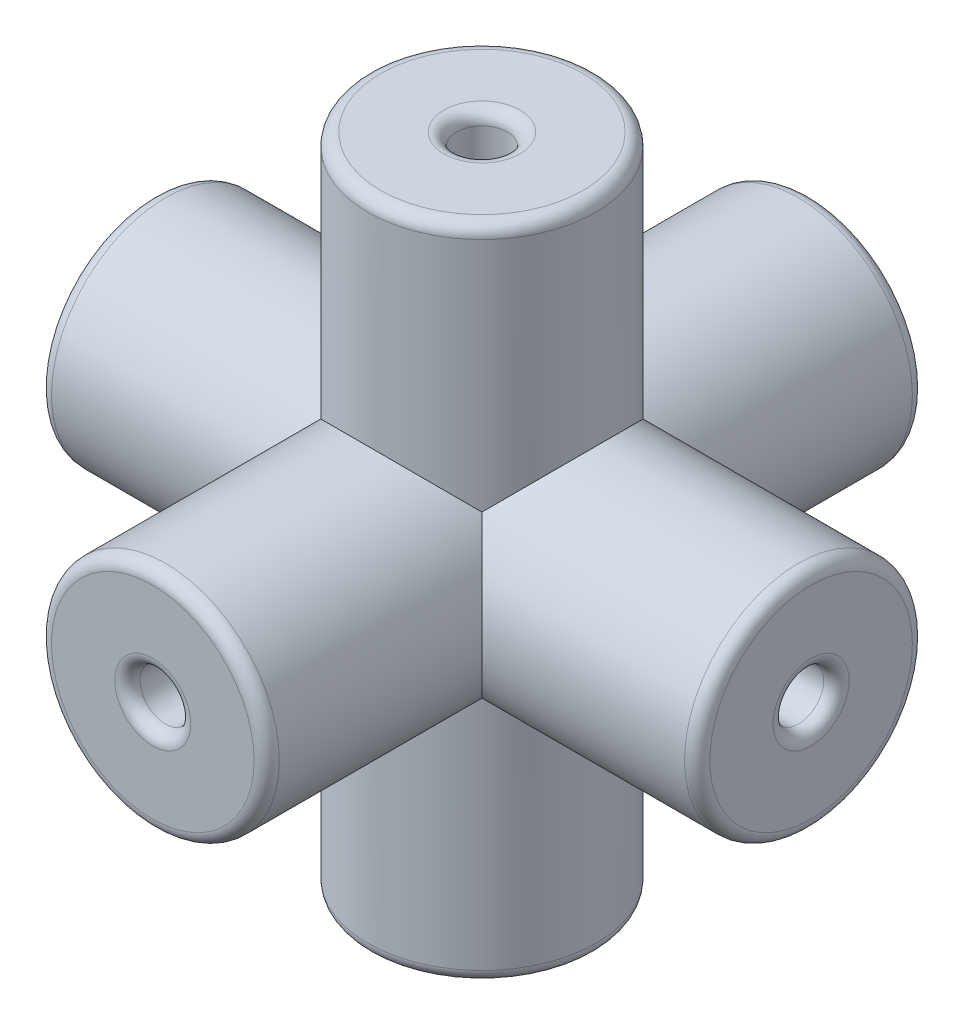
ISO-10303-21;
HEADER;
FILE_DESCRIPTION(('STEP AP214'),'2;1');
FILE_NAME('part.step','',(''),(''),'','','');
FILE_SCHEMA(('AUTOMOTIVE_DESIGN { 1 0 10303 214 1 1 1 1 }'));
ENDSEC;
DATA;
#1=APPLICATION_CONTEXT('core data for automotive mechanical design processes');
#2=APPLICATION_PROTOCOL_DEFINITION('international standard','automotive_design',2000,#1);
#3=PRODUCT_CONTEXT('',#1,'mechanical');
#4=PRODUCT('Part','Part','',(#3));
#5=PRODUCT_RELATED_PRODUCT_CATEGORY('part','',(#4));
#6=PRODUCT_DEFINITION_FORMATION('','',#4);
#7=PRODUCT_DEFINITION_CONTEXT('part definition',#1,'design');
#8=PRODUCT_DEFINITION('design','',#6,#7);
#9=PRODUCT_DEFINITION_SHAPE('','',#8);
#10=(LENGTH_UNIT() NAMED_UNIT(*) SI_UNIT(.MILLI.,.METRE.));
#11=(NAMED_UNIT(*) PLANE_ANGLE_UNIT() SI_UNIT($,.RADIAN.));
#12=(NAMED_UNIT(*) SI_UNIT($,.STERADIAN.) SOLID_ANGLE_UNIT());
#13=UNCERTAINTY_MEASURE_WITH_UNIT(LENGTH_MEASURE(1.E-05),#10,'distance_accuracy_value','');
#14=(GEOMETRIC_REPRESENTATION_CONTEXT(3) GLOBAL_UNCERTAINTY_ASSIGNED_CONTEXT((#13)) GLOBAL_UNIT_ASSIGNED_CONTEXT((#10,
#11,#12)) REPRESENTATION_CONTEXT('',''));
#15=CARTESIAN_POINT('',(0.,0.,0.));
#16=DIRECTION('',(0.,0.,1.));
#17=DIRECTION('',(1.,0.,0.));
#18=AXIS2_PLACEMENT_3D('',#15,#16,#17);
#19=CARTESIAN_POINT('',(0.,13.,0.));
#20=DIRECTION('',(0.,1.,0.));
#21=DIRECTION('',(0.,0.,1.));
#22=AXIS2_PLACEMENT_3D('',#19,#20,#21);
#23=CYLINDRICAL_SURFACE('',#22,0.999999999999997);
#24=CARTESIAN_POINT('',(0.,12.5,0.));
#25=DIRECTION('',(0.,1.,0.));
#26=DIRECTION('',(0.,0.,1.));
#27=AXIS2_PLACEMENT_3D('',#24,#25,#26);
#28=CIRCLE('',#27,0.999999999999997);
#29=CARTESIAN_POINT('',(0.,12.5,0.999999999999997));
#30=VERTEX_POINT('',#29);
#31=EDGE_CURVE('E155',#30,#30,#28,.T.);
#32=ORIENTED_EDGE('',*,*,#31,.T.);
#33=EDGE_LOOP('',(#32));
#34=FACE_BOUND('',#33,.T.);
#35=CARTESIAN_POINT('',(0.,0.,0.));
#36=DIRECTION('',(0.707106781186547,0.707106781186547,0.));
#37=DIRECTION('',(-0.707106781186547,0.707106781186547,0.));
#38=AXIS2_PLACEMENT_3D('',#35,#36,#37);
#39=ELLIPSE('',#38,1.41421356237309,0.999999999999994);
#40=CARTESIAN_POINT('',(-0.707106781186542,0.707106781186542,0.707106781186542));
#41=VERTEX_POINT('',#40);
#42=CARTESIAN_POINT('',(-0.707106781186542,0.707106781186542,-0.707106781186542));
#43=VERTEX_POINT('',#42);
#44=EDGE_CURVE('E111',#41,#43,#39,.F.);
#45=ORIENTED_EDGE('',*,*,#44,.T.);
#46=CARTESIAN_POINT('',(0.,0.,0.));
#47=DIRECTION('',(0.,0.707106781186547,0.707106781186547));
#48=DIRECTION('',(0.,0.707106781186547,-0.707106781186547));
#49=AXIS2_PLACEMENT_3D('',#46,#47,#48);
#50=ELLIPSE('',#49,1.41421356237309,0.999999999999994);
#51=CARTESIAN_POINT('',(0.707106781186542,0.707106781186542,-0.707106781186542));
#52=VERTEX_POINT('',#51);
#53=EDGE_CURVE('E248',#43,#52,#50,.F.);
#54=ORIENTED_EDGE('',*,*,#53,.T.);
#55=CARTESIAN_POINT('',(0.,0.,0.));
#56=DIRECTION('',(-0.707106781186547,0.707106781186547,0.));
#57=DIRECTION('',(0.707106781186547,0.707106781186547,0.));
#58=AXIS2_PLACEMENT_3D('',#55,#56,#57);
#59=ELLIPSE('',#58,1.41421356237309,0.999999999999994);
#60=CARTESIAN_POINT('',(0.707106781186543,0.707106781186543,0.707106781186543));
#61=VERTEX_POINT('',#60);
#62=EDGE_CURVE('E105',#52,#61,#59,.F.);
#63=ORIENTED_EDGE('',*,*,#62,.T.);
#64=CARTESIAN_POINT('',(0.,0.,0.));
#65=DIRECTION('',(0.,0.707106781186547,-0.707106781186547));
#66=DIRECTION('',(0.,0.707106781186547,0.707106781186547));
#67=AXIS2_PLACEMENT_3D('',#64,#65,#66);
#68=ELLIPSE('',#67,1.41421356237309,0.999999999999994);
#69=EDGE_CURVE('E98',#61,#41,#68,.F.);
#70=ORIENTED_EDGE('',*,*,#69,.T.);
#71=EDGE_LOOP('',(#45,#54,#63,#70));
#72=FACE_BOUND('',#71,.T.);
#73=ADVANCED_FACE('F33',(#34,#72),#23,.F.);
#74=CARTESIAN_POINT('',(0.,0.,13.));
#75=DIRECTION('',(0.,0.,-1.));
#76=DIRECTION('',(-1.,0.,0.));
#77=AXIS2_PLACEMENT_3D('',#74,#75,#76);
#78=CYLINDRICAL_SURFACE('',#77,4.5);
#79=CARTESIAN_POINT('',(0.,0.,12.5));
#80=DIRECTION('',(0.,0.,1.));
#81=DIRECTION('',(1.,0.,0.));
#82=AXIS2_PLACEMENT_3D('',#79,#80,#81);
#83=CIRCLE('',#82,4.5);
#84=CARTESIAN_POINT('',(4.5,0.,12.5));
#85=VERTEX_POINT('',#84);
#86=EDGE_CURVE('E188',#85,#85,#83,.F.);
#87=ORIENTED_EDGE('',*,*,#86,.T.);
#88=EDGE_LOOP('',(#87));
#89=FACE_BOUND('',#88,.T.);
#90=CARTESIAN_POINT('',(0.,0.,0.));
#91=DIRECTION('',(-0.707106781186547,0.,-0.707106781186547));
#92=DIRECTION('',(0.707106781186547,0.,-0.707106781186547));
#93=AXIS2_PLACEMENT_3D('',#90,#91,#92);
#94=ELLIPSE('',#93,6.36396103067893,4.5);
#95=CARTESIAN_POINT('',(-3.18198051533946,-3.18198051533946,3.18198051533946));
#96=VERTEX_POINT('',#95);
#97=CARTESIAN_POINT('',(-3.18198051533946,3.18198051533946,3.18198051533946));
#98=VERTEX_POINT('',#97);
#99=EDGE_CURVE('E270',#96,#98,#94,.T.);
#100=ORIENTED_EDGE('',*,*,#99,.F.);
#101=CARTESIAN_POINT('',(0.,0.,0.));
#102=DIRECTION('',(0.,-0.707106781186547,-0.707106781186547));
#103=DIRECTION('',(0.,0.707106781186547,-0.707106781186547));
#104=AXIS2_PLACEMENT_3D('',#101,#102,#103);
#105=ELLIPSE('',#104,6.36396103067893,4.5);
#106=CARTESIAN_POINT('',(3.18198051533946,-3.18198051533946,3.18198051533946));
#107=VERTEX_POINT('',#106);
#108=EDGE_CURVE('E278',#107,#96,#105,.T.);
#109=ORIENTED_EDGE('',*,*,#108,.F.);
#110=CARTESIAN_POINT('',(0.,0.,0.));
#111=DIRECTION('',(0.707106781186547,0.,-0.707106781186547));
#112=DIRECTION('',(-0.707106781186547,0.,-0.707106781186547));
#113=AXIS2_PLACEMENT_3D('',#110,#111,#112);
#114=ELLIPSE('',#113,6.36396103067893,4.5);
#115=CARTESIAN_POINT('',(3.18198051533947,3.18198051533946,3.18198051533946));
#116=VERTEX_POINT('',#115);
#117=EDGE_CURVE('E261',#116,#107,#114,.T.);
#118=ORIENTED_EDGE('',*,*,#117,.F.);
#119=CARTESIAN_POINT('',(0.,0.,0.));
#120=DIRECTION('',(0.,0.707106781186547,-0.707106781186547));
#121=DIRECTION('',(0.,-0.707106781186547,-0.707106781186547));
#122=AXIS2_PLACEMENT_3D('',#119,#120,#121);
#123=ELLIPSE('',#122,6.36396103067893,4.5);
#124=EDGE_CURVE('E276',#98,#116,#123,.T.);
#125=ORIENTED_EDGE('',*,*,#124,.F.);
#126=EDGE_LOOP('',(#100,#109,#118,#125));
#127=FACE_BOUND('',#126,.T.);
#128=ADVANCED_FACE('F222',(#89,#127),#78,.T.);
#129=CARTESIAN_POINT('',(0.,13.,0.));
#130=DIRECTION('',(0.,-1.,0.));
#131=DIRECTION('',(0.,0.,-1.));
#132=AXIS2_PLACEMENT_3D('',#129,#130,#131);
#133=CYLINDRICAL_SURFACE('',#132,4.5);
#134=CARTESIAN_POINT('',(0.,-12.5,0.));
#135=DIRECTION('',(0.,1.,0.));
#136=DIRECTION('',(0.,0.,1.));
#137=AXIS2_PLACEMENT_3D('',#134,#135,#136);
#138=CIRCLE('',#137,4.5);
#139=CARTESIAN_POINT('',(0.,-12.5,4.5));
#140=VERTEX_POINT('',#139);
#141=EDGE_CURVE('E140',#140,#140,#138,.T.);
#142=ORIENTED_EDGE('',*,*,#141,.T.);
#143=EDGE_LOOP('',(#142));
#144=FACE_BOUND('',#143,.T.);
#145=CARTESIAN_POINT('',(0.,0.,0.));
#146=DIRECTION('',(-0.707106781186547,-0.707106781186547,0.));
#147=DIRECTION('',(0.707106781186547,-0.707106781186547,0.));
#148=AXIS2_PLACEMENT_3D('',#145,#146,#147);
#149=ELLIPSE('',#148,6.36396103067893,4.5);
#150=CARTESIAN_POINT('',(3.18198051533946,-3.18198051533946,-3.18198051533946));
#151=VERTEX_POINT('',#150);
#152=EDGE_CURVE('E258',#107,#151,#149,.F.);
#153=ORIENTED_EDGE('',*,*,#152,.F.);
#154=ORIENTED_EDGE('',*,*,#108,.T.);
#155=CARTESIAN_POINT('',(0.,0.,0.));
#156=DIRECTION('',(0.707106781186547,-0.707106781186547,0.));
#157=DIRECTION('',(-0.707106781186547,-0.707106781186547,0.));
#158=AXIS2_PLACEMENT_3D('',#155,#156,#157);
#159=ELLIPSE('',#158,6.36396103067893,4.5);
#160=CARTESIAN_POINT('',(-3.18198051533946,-3.18198051533946,-3.18198051533946));
#161=VERTEX_POINT('',#160);
#162=EDGE_CURVE('E267',#161,#96,#159,.F.);
#163=ORIENTED_EDGE('',*,*,#162,.F.);
#164=CARTESIAN_POINT('',(0.,0.,0.));
#165=DIRECTION('',(0.,0.707106781186547,-0.707106781186547));
#166=DIRECTION('',(0.,-0.707106781186547,-0.707106781186547));
#167=AXIS2_PLACEMENT_3D('',#164,#165,#166);
#168=ELLIPSE('',#167,6.36396103067893,4.5);
#169=EDGE_CURVE('E273',#161,#151,#168,.F.);
#170=ORIENTED_EDGE('',*,*,#169,.T.);
#171=EDGE_LOOP('',(#153,#154,#163,#170));
#172=FACE_BOUND('',#171,.T.);
#173=ADVANCED_FACE('F229',(#144,#172),#133,.T.);
#174=CARTESIAN_POINT('',(0.,0.,-12.5));
#175=DIRECTION('',(0.,0.,1.));
#176=DIRECTION('',(1.,0.,0.));
#177=AXIS2_PLACEMENT_3D('',#174,#175,#176);
#178=CIRCLE('',#177,4.5);
#179=CARTESIAN_POINT('',(4.5,0.,-12.5));
#180=VERTEX_POINT('',#179);
#181=EDGE_CURVE('E167',#180,#180,#178,.T.);
#182=ORIENTED_EDGE('',*,*,#181,.T.);
#183=EDGE_LOOP('',(#182));
#184=FACE_BOUND('',#183,.T.);
#185=CARTESIAN_POINT('',(0.,0.,0.));
#186=DIRECTION('',(-0.707106781186547,0.,-0.707106781186547));
#187=DIRECTION('',(0.707106781186547,0.,-0.707106781186547));
#188=AXIS2_PLACEMENT_3D('',#185,#186,#187);
#189=ELLIPSE('',#188,6.36396103067893,4.5);
#190=CARTESIAN_POINT('',(3.18198051533947,3.18198051533946,-3.18198051533946));
#191=VERTEX_POINT('',#190);
#192=EDGE_CURVE('E251',#151,#191,#189,.F.);
#193=ORIENTED_EDGE('',*,*,#192,.F.);
#194=ORIENTED_EDGE('',*,*,#169,.F.);
#195=CARTESIAN_POINT('',(0.,0.,0.));
#196=DIRECTION('',(0.707106781186547,0.,-0.707106781186547));
#197=DIRECTION('',(-0.707106781186547,0.,-0.707106781186547));
#198=AXIS2_PLACEMENT_3D('',#195,#196,#197);
#199=ELLIPSE('',#198,6.36396103067893,4.5);
#200=CARTESIAN_POINT('',(-3.18198051533946,3.18198051533946,-3.18198051533946));
#201=VERTEX_POINT('',#200);
#202=EDGE_CURVE('E264',#201,#161,#199,.F.);
#203=ORIENTED_EDGE('',*,*,#202,.F.);
#204=CARTESIAN_POINT('',(0.,0.,0.));
#205=DIRECTION('',(0.,-0.707106781186547,-0.707106781186547));
#206=DIRECTION('',(0.,0.707106781186547,-0.707106781186547));
#207=AXIS2_PLACEMENT_3D('',#204,#205,#206);
#208=ELLIPSE('',#207,6.36396103067893,4.5);
#209=EDGE_CURVE('E281',#191,#201,#208,.F.);
#210=ORIENTED_EDGE('',*,*,#209,.F.);
#211=EDGE_LOOP('',(#193,#194,#203,#210));
#212=FACE_BOUND('',#211,.T.);
#213=ADVANCED_FACE('F232',(#184,#212),#78,.T.);
#214=CARTESIAN_POINT('',(0.,12.5,0.));
#215=DIRECTION('',(0.,1.,0.));
#216=DIRECTION('',(0.,0.,1.));
#217=AXIS2_PLACEMENT_3D('',#214,#215,#216);
#218=CIRCLE('',#217,4.5);
#219=CARTESIAN_POINT('',(0.,12.5,4.5));
#220=VERTEX_POINT('',#219);
#221=EDGE_CURVE('E164',#220,#220,#218,.F.);
#222=ORIENTED_EDGE('',*,*,#221,.T.);
#223=EDGE_LOOP('',(#222));
#224=FACE_BOUND('',#223,.T.);
#225=CARTESIAN_POINT('',(0.,0.,0.));
#226=DIRECTION('',(-0.707106781186547,-0.707106781186547,0.));
#227=DIRECTION('',(0.707106781186547,-0.707106781186547,0.));
#228=AXIS2_PLACEMENT_3D('',#225,#226,#227);
#229=ELLIPSE('',#228,6.36396103067893,4.5);
#230=EDGE_CURVE('E118',#98,#201,#229,.T.);
#231=ORIENTED_EDGE('',*,*,#230,.F.);
#232=ORIENTED_EDGE('',*,*,#124,.T.);
#233=CARTESIAN_POINT('',(0.,0.,0.));
#234=DIRECTION('',(0.707106781186547,-0.707106781186547,0.));
#235=DIRECTION('',(-0.707106781186547,-0.707106781186547,0.));
#236=AXIS2_PLACEMENT_3D('',#233,#234,#235);
#237=ELLIPSE('',#236,6.36396103067893,4.5);
#238=EDGE_CURVE('E124',#191,#116,#237,.T.);
#239=ORIENTED_EDGE('',*,*,#238,.F.);
#240=ORIENTED_EDGE('',*,*,#209,.T.);
#241=EDGE_LOOP('',(#231,#232,#239,#240));
#242=FACE_BOUND('',#241,.T.);
#243=ADVANCED_FACE('F287',(#224,#242),#133,.T.);
#244=CARTESIAN_POINT('',(0.,0.,13.));
#245=DIRECTION('',(0.,0.,1.));
#246=DIRECTION('',(1.,0.,0.));
#247=AXIS2_PLACEMENT_3D('',#244,#245,#246);
#248=PLANE('',#247);
#249=CARTESIAN_POINT('',(0.,0.,13.));
#250=DIRECTION('',(0.,0.,1.));
#251=DIRECTION('',(1.,0.,0.));
#252=AXIS2_PLACEMENT_3D('',#249,#250,#251);
#253=CIRCLE('',#252,1.49999999999999);
#254=CARTESIAN_POINT('',(1.49999999999999,0.,13.));
#255=VERTEX_POINT('',#254);
#256=EDGE_CURVE('E185',#255,#255,#253,.F.);
#257=ORIENTED_EDGE('',*,*,#256,.T.);
#258=EDGE_LOOP('',(#257));
#259=FACE_BOUND('',#258,.T.);
#260=CARTESIAN_POINT('',(0.,0.,13.));
#261=DIRECTION('',(0.,0.,1.));
#262=DIRECTION('',(1.,0.,0.));
#263=AXIS2_PLACEMENT_3D('',#260,#261,#262);
#264=CIRCLE('',#263,4.);
#265=CARTESIAN_POINT('',(4.,0.,13.));
#266=VERTEX_POINT('',#265);
#267=EDGE_CURVE('E182',#266,#266,#264,.T.);
#268=ORIENTED_EDGE('',*,*,#267,.T.);
#269=EDGE_LOOP('',(#268));
#270=FACE_BOUND('',#269,.T.);
#271=ADVANCED_FACE('F306',(#259,#270),#248,.T.);
#272=CARTESIAN_POINT('',(0.,-13.,0.));
#273=DIRECTION('',(0.,1.,0.));
#274=DIRECTION('',(0.,0.,1.));
#275=AXIS2_PLACEMENT_3D('',#272,#273,#274);
#276=PLANE('',#275);
#277=CARTESIAN_POINT('',(0.,-13.,0.));
#278=DIRECTION('',(0.,1.,0.));
#279=DIRECTION('',(0.,0.,1.));
#280=AXIS2_PLACEMENT_3D('',#277,#278,#279);
#281=CIRCLE('',#280,1.5);
#282=CARTESIAN_POINT('',(0.,-13.,1.5));
#283=VERTEX_POINT('',#282);
#284=EDGE_CURVE('E134',#283,#283,#281,.T.);
#285=ORIENTED_EDGE('',*,*,#284,.T.);
#286=EDGE_LOOP('',(#285));
#287=FACE_BOUND('',#286,.T.);
#288=CARTESIAN_POINT('',(0.,-13.,0.));
#289=DIRECTION('',(0.,1.,0.));
#290=DIRECTION('',(0.,0.,1.));
#291=AXIS2_PLACEMENT_3D('',#288,#289,#290);
#292=CIRCLE('',#291,4.);
#293=CARTESIAN_POINT('',(0.,-13.,4.));
#294=VERTEX_POINT('',#293);
#295=EDGE_CURVE('E131',#294,#294,#292,.F.);
#296=ORIENTED_EDGE('',*,*,#295,.T.);
#297=EDGE_LOOP('',(#296));
#298=FACE_BOUND('',#297,.T.);
#299=ADVANCED_FACE('F311',(#287,#298),#276,.F.);
#300=CARTESIAN_POINT('',(0.,0.,-13.));
#301=DIRECTION('',(0.,0.,1.));
#302=DIRECTION('',(1.,0.,0.));
#303=AXIS2_PLACEMENT_3D('',#300,#301,#302);
#304=PLANE('',#303);
#305=CARTESIAN_POINT('',(0.,0.,-13.));
#306=DIRECTION('',(0.,0.,1.));
#307=DIRECTION('',(1.,0.,0.));
#308=AXIS2_PLACEMENT_3D('',#305,#306,#307);
#309=CIRCLE('',#308,4.);
#310=CARTESIAN_POINT('',(4.,0.,-13.));
#311=VERTEX_POINT('',#310);
#312=EDGE_CURVE('E173',#311,#311,#309,.F.);
#313=ORIENTED_EDGE('',*,*,#312,.T.);
#314=EDGE_LOOP('',(#313));
#315=FACE_BOUND('',#314,.T.);
#316=CARTESIAN_POINT('',(0.,0.,-13.));
#317=DIRECTION('',(0.,0.,1.));
#318=DIRECTION('',(1.,0.,0.));
#319=AXIS2_PLACEMENT_3D('',#316,#317,#318);
#320=CIRCLE('',#319,1.49999999999999);
#321=CARTESIAN_POINT('',(1.49999999999999,0.,-13.));
#322=VERTEX_POINT('',#321);
#323=EDGE_CURVE('E170',#322,#322,#320,.T.);
#324=ORIENTED_EDGE('',*,*,#323,.T.);
#325=EDGE_LOOP('',(#324));
#326=FACE_BOUND('',#325,.T.);
#327=ADVANCED_FACE('F324',(#315,#326),#304,.F.);
#328=CARTESIAN_POINT('',(0.,13.,0.));
#329=DIRECTION('',(0.,1.,0.));
#330=DIRECTION('',(0.,0.,1.));
#331=AXIS2_PLACEMENT_3D('',#328,#329,#330);
#332=PLANE('',#331);
#333=CARTESIAN_POINT('',(0.,13.,0.));
#334=DIRECTION('',(0.,1.,0.));
#335=DIRECTION('',(0.,0.,1.));
#336=AXIS2_PLACEMENT_3D('',#333,#334,#335);
#337=CIRCLE('',#336,1.5);
#338=CARTESIAN_POINT('',(0.,13.,1.5));
#339=VERTEX_POINT('',#338);
#340=EDGE_CURVE('E161',#339,#339,#337,.F.);
#341=ORIENTED_EDGE('',*,*,#340,.T.);
#342=EDGE_LOOP('',(#341));
#343=FACE_BOUND('',#342,.T.);
#344=CARTESIAN_POINT('',(0.,13.,0.));
#345=DIRECTION('',(0.,1.,0.));
#346=DIRECTION('',(0.,0.,1.));
#347=AXIS2_PLACEMENT_3D('',#344,#345,#346);
#348=CIRCLE('',#347,4.);
#349=CARTESIAN_POINT('',(0.,13.,4.));
#350=VERTEX_POINT('',#349);
#351=EDGE_CURVE('E158',#350,#350,#348,.T.);
#352=ORIENTED_EDGE('',*,*,#351,.T.);
#353=EDGE_LOOP('',(#352));
#354=FACE_BOUND('',#353,.T.);
#355=ADVANCED_FACE('F212',(#343,#354),#332,.T.);
#356=CARTESIAN_POINT('',(13.,0.,0.));
#357=DIRECTION('',(1.,0.,0.));
#358=DIRECTION('',(0.,0.,-1.));
#359=AXIS2_PLACEMENT_3D('',#356,#357,#358);
#360=PLANE('',#359);
#361=CARTESIAN_POINT('',(13.,0.,0.));
#362=DIRECTION('',(1.,0.,0.));
#363=DIRECTION('',(0.,0.,-1.));
#364=AXIS2_PLACEMENT_3D('',#361,#362,#363);
#365=CIRCLE('',#364,1.49999999999999);
#366=CARTESIAN_POINT('',(13.,0.,-1.49999999999999));
#367=VERTEX_POINT('',#366);
#368=EDGE_CURVE('E194',#367,#367,#365,.F.);
#369=ORIENTED_EDGE('',*,*,#368,.T.);
#370=EDGE_LOOP('',(#369));
#371=FACE_BOUND('',#370,.T.);
#372=CARTESIAN_POINT('',(13.,0.,0.));
#373=DIRECTION('',(1.,0.,0.));
#374=DIRECTION('',(0.,0.,-1.));
#375=AXIS2_PLACEMENT_3D('',#372,#373,#374);
#376=CIRCLE('',#375,4.);
#377=CARTESIAN_POINT('',(13.,0.,-4.));
#378=VERTEX_POINT('',#377);
#379=EDGE_CURVE('E191',#378,#378,#376,.T.);
#380=ORIENTED_EDGE('',*,*,#379,.T.);
#381=EDGE_LOOP('',(#380));
#382=FACE_BOUND('',#381,.T.);
#383=ADVANCED_FACE('F208',(#371,#382),#360,.T.);
#384=CARTESIAN_POINT('',(13.,0.,0.));
#385=DIRECTION('',(-1.,0.,0.));
#386=DIRECTION('',(0.,0.,1.));
#387=AXIS2_PLACEMENT_3D('',#384,#385,#386);
#388=CYLINDRICAL_SURFACE('',#387,4.5);
#389=CARTESIAN_POINT('',(12.5,0.,0.));
#390=DIRECTION('',(1.,0.,0.));
#391=DIRECTION('',(0.,0.,-1.));
#392=AXIS2_PLACEMENT_3D('',#389,#390,#391);
#393=CIRCLE('',#392,4.5);
#394=CARTESIAN_POINT('',(12.5,0.,-4.5));
#395=VERTEX_POINT('',#394);
#396=EDGE_CURVE('E11',#395,#395,#393,.F.);
#397=ORIENTED_EDGE('',*,*,#396,.T.);
#398=EDGE_LOOP('',(#397));
#399=FACE_BOUND('',#398,.T.);
#400=ORIENTED_EDGE('',*,*,#238,.T.);
#401=ORIENTED_EDGE('',*,*,#117,.T.);
#402=ORIENTED_EDGE('',*,*,#152,.T.);
#403=ORIENTED_EDGE('',*,*,#192,.T.);
#404=EDGE_LOOP('',(#400,#401,#402,#403));
#405=FACE_BOUND('',#404,.T.);
#406=ADVANCED_FACE('F211',(#399,#405),#388,.T.);
#407=CARTESIAN_POINT('',(-12.5,0.,0.));
#408=DIRECTION('',(1.,0.,0.));
#409=DIRECTION('',(0.,0.,-1.));
#410=AXIS2_PLACEMENT_3D('',#407,#408,#409);
#411=CIRCLE('',#410,4.5);
#412=CARTESIAN_POINT('',(-12.5,0.,-4.5));
#413=VERTEX_POINT('',#412);
#414=EDGE_CURVE('E143',#413,#413,#411,.T.);
#415=ORIENTED_EDGE('',*,*,#414,.T.);
#416=EDGE_LOOP('',(#415));
#417=FACE_BOUND('',#416,.T.);
#418=ORIENTED_EDGE('',*,*,#162,.T.);
#419=ORIENTED_EDGE('',*,*,#99,.T.);
#420=ORIENTED_EDGE('',*,*,#230,.T.);
#421=ORIENTED_EDGE('',*,*,#202,.T.);
#422=EDGE_LOOP('',(#418,#419,#420,#421));
#423=FACE_BOUND('',#422,.T.);
#424=ADVANCED_FACE('F242',(#417,#423),#388,.T.);
#425=CARTESIAN_POINT('',(-13.,0.,0.));
#426=DIRECTION('',(1.,0.,0.));
#427=DIRECTION('',(0.,0.,-1.));
#428=AXIS2_PLACEMENT_3D('',#425,#426,#427);
#429=PLANE('',#428);
#430=CARTESIAN_POINT('',(-13.,0.,0.));
#431=DIRECTION('',(1.,0.,0.));
#432=DIRECTION('',(0.,0.,-1.));
#433=AXIS2_PLACEMENT_3D('',#430,#431,#432);
#434=CIRCLE('',#433,4.);
#435=CARTESIAN_POINT('',(-13.,0.,-4.));
#436=VERTEX_POINT('',#435);
#437=EDGE_CURVE('E149',#436,#436,#434,.F.);
#438=ORIENTED_EDGE('',*,*,#437,.T.);
#439=EDGE_LOOP('',(#438));
#440=FACE_BOUND('',#439,.T.);
#441=CARTESIAN_POINT('',(-13.,0.,0.));
#442=DIRECTION('',(1.,0.,0.));
#443=DIRECTION('',(0.,0.,-1.));
#444=AXIS2_PLACEMENT_3D('',#441,#442,#443);
#445=CIRCLE('',#444,1.49999999999999);
#446=CARTESIAN_POINT('',(-13.,0.,-1.49999999999999));
#447=VERTEX_POINT('',#446);
#448=EDGE_CURVE('E146',#447,#447,#445,.T.);
#449=ORIENTED_EDGE('',*,*,#448,.T.);
#450=EDGE_LOOP('',(#449));
#451=FACE_BOUND('',#450,.T.);
#452=ADVANCED_FACE('F235',(#440,#451),#429,.F.);
#453=CARTESIAN_POINT('',(0.,-12.5,0.));
#454=DIRECTION('',(0.,1.,0.));
#455=DIRECTION('',(0.,0.,1.));
#456=AXIS2_PLACEMENT_3D('',#453,#454,#455);
#457=CIRCLE('',#456,0.999999999999997);
#458=CARTESIAN_POINT('',(0.,-12.5,0.999999999999997));
#459=VERTEX_POINT('',#458);
#460=EDGE_CURVE('E137',#459,#459,#457,.F.);
#461=ORIENTED_EDGE('',*,*,#460,.T.);
#462=EDGE_LOOP('',(#461));
#463=FACE_BOUND('',#462,.T.);
#464=CARTESIAN_POINT('',(0.,0.,0.));
#465=DIRECTION('',(-0.707106781186547,0.707106781186547,0.));
#466=DIRECTION('',(0.707106781186547,0.707106781186547,0.));
#467=AXIS2_PLACEMENT_3D('',#464,#465,#466);
#468=ELLIPSE('',#467,1.41421356237309,0.999999999999994);
#469=CARTESIAN_POINT('',(-0.707106781186543,-0.707106781186543,-0.707106781186543));
#470=VERTEX_POINT('',#469);
#471=CARTESIAN_POINT('',(-0.707106781186542,-0.707106781186542,0.707106781186542));
#472=VERTEX_POINT('',#471);
#473=EDGE_CURVE('E121',#470,#472,#468,.T.);
#474=ORIENTED_EDGE('',*,*,#473,.T.);
#475=CARTESIAN_POINT('',(0.,0.,0.));
#476=DIRECTION('',(0.,0.707106781186547,0.707106781186547));
#477=DIRECTION('',(0.,0.707106781186547,-0.707106781186547));
#478=AXIS2_PLACEMENT_3D('',#475,#476,#477);
#479=ELLIPSE('',#478,1.41421356237309,0.999999999999994);
#480=CARTESIAN_POINT('',(0.707106781186542,-0.707106781186542,0.707106781186542));
#481=VERTEX_POINT('',#480);
#482=EDGE_CURVE('E56',#472,#481,#479,.T.);
#483=ORIENTED_EDGE('',*,*,#482,.T.);
#484=CARTESIAN_POINT('',(0.,0.,0.));
#485=DIRECTION('',(0.707106781186547,0.707106781186547,0.));
#486=DIRECTION('',(-0.707106781186547,0.707106781186547,0.));
#487=AXIS2_PLACEMENT_3D('',#484,#485,#486);
#488=ELLIPSE('',#487,1.41421356237309,0.999999999999994);
#489=CARTESIAN_POINT('',(0.707106781186542,-0.707106781186542,-0.707106781186542));
#490=VERTEX_POINT('',#489);
#491=EDGE_CURVE('E117',#481,#490,#488,.T.);
#492=ORIENTED_EDGE('',*,*,#491,.T.);
#493=CARTESIAN_POINT('',(0.,0.,0.));
#494=DIRECTION('',(0.,0.707106781186547,-0.707106781186547));
#495=DIRECTION('',(0.,0.707106781186547,0.707106781186547));
#496=AXIS2_PLACEMENT_3D('',#493,#494,#495);
#497=ELLIPSE('',#496,1.41421356237309,0.999999999999994);
#498=EDGE_CURVE('E48',#490,#470,#497,.T.);
#499=ORIENTED_EDGE('',*,*,#498,.T.);
#500=EDGE_LOOP('',(#474,#483,#492,#499));
#501=FACE_BOUND('',#500,.T.);
#502=ADVANCED_FACE('F225',(#463,#501),#23,.F.);
#503=CARTESIAN_POINT('',(-13.,0.,0.));
#504=DIRECTION('',(-1.,0.,0.));
#505=DIRECTION('',(0.,0.,1.));
#506=AXIS2_PLACEMENT_3D('',#503,#504,#505);
#507=CYLINDRICAL_SURFACE('',#506,0.999999999999991);
#508=CARTESIAN_POINT('',(-12.5,0.,0.));
#509=DIRECTION('',(1.,0.,0.));
#510=DIRECTION('',(0.,0.,-1.));
#511=AXIS2_PLACEMENT_3D('',#508,#509,#510);
#512=CIRCLE('',#511,0.999999999999991);
#513=CARTESIAN_POINT('',(-12.5,0.,-0.999999999999991));
#514=VERTEX_POINT('',#513);
#515=EDGE_CURVE('E152',#514,#514,#512,.F.);
#516=ORIENTED_EDGE('',*,*,#515,.T.);
#517=EDGE_LOOP('',(#516));
#518=FACE_BOUND('',#517,.T.);
#519=ORIENTED_EDGE('',*,*,#473,.F.);
#520=CARTESIAN_POINT('',(0.,0.,0.));
#521=DIRECTION('',(-0.707106781186547,0.,0.707106781186547));
#522=DIRECTION('',(-0.707106781186547,0.,-0.707106781186547));
#523=AXIS2_PLACEMENT_3D('',#520,#521,#522);
#524=ELLIPSE('',#523,1.41421356237308,0.999999999999991);
#525=EDGE_CURVE('E104',#470,#43,#524,.F.);
#526=ORIENTED_EDGE('',*,*,#525,.T.);
#527=ORIENTED_EDGE('',*,*,#44,.F.);
#528=CARTESIAN_POINT('',(0.,0.,0.));
#529=DIRECTION('',(-0.707106781186547,0.,-0.707106781186547));
#530=DIRECTION('',(-0.707106781186547,0.,0.707106781186547));
#531=AXIS2_PLACEMENT_3D('',#528,#529,#530);
#532=ELLIPSE('',#531,1.41421356237308,0.999999999999991);
#533=EDGE_CURVE('E95',#41,#472,#532,.F.);
#534=ORIENTED_EDGE('',*,*,#533,.T.);
#535=EDGE_LOOP('',(#519,#526,#527,#534));
#536=FACE_BOUND('',#535,.T.);
#537=ADVANCED_FACE('F116',(#518,#536),#507,.F.);
#538=CARTESIAN_POINT('',(12.5,0.,0.));
#539=DIRECTION('',(1.,0.,0.));
#540=DIRECTION('',(0.,0.,-1.));
#541=AXIS2_PLACEMENT_3D('',#538,#539,#540);
#542=CIRCLE('',#541,0.999999999999991);
#543=CARTESIAN_POINT('',(12.5,0.,-0.999999999999991));
#544=VERTEX_POINT('',#543);
#545=EDGE_CURVE('E41',#544,#544,#542,.T.);
#546=ORIENTED_EDGE('',*,*,#545,.T.);
#547=EDGE_LOOP('',(#546));
#548=FACE_BOUND('',#547,.T.);
#549=ORIENTED_EDGE('',*,*,#491,.F.);
#550=CARTESIAN_POINT('',(0.,0.,0.));
#551=DIRECTION('',(-0.707106781186547,0.,0.707106781186547));
#552=DIRECTION('',(-0.707106781186547,0.,-0.707106781186547));
#553=AXIS2_PLACEMENT_3D('',#550,#551,#552);
#554=ELLIPSE('',#553,1.41421356237308,0.999999999999991);
#555=EDGE_CURVE('E113',#481,#61,#554,.T.);
#556=ORIENTED_EDGE('',*,*,#555,.T.);
#557=ORIENTED_EDGE('',*,*,#62,.F.);
#558=CARTESIAN_POINT('',(0.,0.,0.));
#559=DIRECTION('',(-0.707106781186547,0.,-0.707106781186547));
#560=DIRECTION('',(-0.707106781186547,0.,0.707106781186547));
#561=AXIS2_PLACEMENT_3D('',#558,#559,#560);
#562=ELLIPSE('',#561,1.41421356237308,0.999999999999991);
#563=EDGE_CURVE('E249',#52,#490,#562,.T.);
#564=ORIENTED_EDGE('',*,*,#563,.T.);
#565=EDGE_LOOP('',(#549,#556,#557,#564));
#566=FACE_BOUND('',#565,.T.);
#567=ADVANCED_FACE('F199',(#548,#566),#507,.F.);
#568=CARTESIAN_POINT('',(0.,0.,13.));
#569=DIRECTION('',(0.,0.,1.));
#570=DIRECTION('',(1.,0.,0.));
#571=AXIS2_PLACEMENT_3D('',#568,#569,#570);
#572=CYLINDRICAL_SURFACE('',#571,0.999999999999991);
#573=CARTESIAN_POINT('',(0.,0.,12.5));
#574=DIRECTION('',(0.,0.,1.));
#575=DIRECTION('',(1.,0.,0.));
#576=AXIS2_PLACEMENT_3D('',#573,#574,#575);
#577=CIRCLE('',#576,0.999999999999991);
#578=CARTESIAN_POINT('',(0.999999999999991,0.,12.5));
#579=VERTEX_POINT('',#578);
#580=EDGE_CURVE('E179',#579,#579,#577,.T.);
#581=ORIENTED_EDGE('',*,*,#580,.T.);
#582=EDGE_LOOP('',(#581));
#583=FACE_BOUND('',#582,.T.);
#584=ORIENTED_EDGE('',*,*,#533,.F.);
#585=ORIENTED_EDGE('',*,*,#69,.F.);
#586=ORIENTED_EDGE('',*,*,#555,.F.);
#587=ORIENTED_EDGE('',*,*,#482,.F.);
#588=EDGE_LOOP('',(#584,#585,#586,#587));
#589=FACE_BOUND('',#588,.T.);
#590=ADVANCED_FACE('F97',(#583,#589),#572,.F.);
#591=CARTESIAN_POINT('',(0.,0.,-12.5));
#592=DIRECTION('',(0.,0.,1.));
#593=DIRECTION('',(1.,0.,0.));
#594=AXIS2_PLACEMENT_3D('',#591,#592,#593);
#595=CIRCLE('',#594,0.999999999999991);
#596=CARTESIAN_POINT('',(0.999999999999991,0.,-12.5));
#597=VERTEX_POINT('',#596);
#598=EDGE_CURVE('E176',#597,#597,#595,.F.);
#599=ORIENTED_EDGE('',*,*,#598,.T.);
#600=EDGE_LOOP('',(#599));
#601=FACE_BOUND('',#600,.T.);
#602=ORIENTED_EDGE('',*,*,#525,.F.);
#603=ORIENTED_EDGE('',*,*,#498,.F.);
#604=ORIENTED_EDGE('',*,*,#563,.F.);
#605=ORIENTED_EDGE('',*,*,#53,.F.);
#606=EDGE_LOOP('',(#602,#603,#604,#605));
#607=FACE_BOUND('',#606,.T.);
#608=ADVANCED_FACE('F355',(#601,#607),#572,.F.);
#609=CARTESIAN_POINT('',(0.,-12.5,0.));
#610=DIRECTION('',(0.,1.,0.));
#611=DIRECTION('',(0.,0.,1.));
#612=AXIS2_PLACEMENT_3D('',#609,#610,#611);
#613=TOROIDAL_SURFACE('',#612,1.5,0.5);
#614=ORIENTED_EDGE('',*,*,#460,.F.);
#615=EDGE_LOOP('',(#614));
#616=FACE_BOUND('',#615,.T.);
#617=ORIENTED_EDGE('',*,*,#284,.F.);
#618=EDGE_LOOP('',(#617));
#619=FACE_BOUND('',#618,.T.);
#620=ADVANCED_FACE('F345',(#616,#619),#613,.T.);
#621=CARTESIAN_POINT('',(0.,-12.5,0.));
#622=DIRECTION('',(0.,1.,0.));
#623=DIRECTION('',(0.,0.,1.));
#624=AXIS2_PLACEMENT_3D('',#621,#622,#623);
#625=TOROIDAL_SURFACE('',#624,4.,0.5);
#626=ORIENTED_EDGE('',*,*,#295,.F.);
#627=EDGE_LOOP('',(#626));
#628=FACE_BOUND('',#627,.T.);
#629=ORIENTED_EDGE('',*,*,#141,.F.);
#630=EDGE_LOOP('',(#629));
#631=FACE_BOUND('',#630,.T.);
#632=ADVANCED_FACE('F341',(#628,#631),#625,.T.);
#633=CARTESIAN_POINT('',(-12.5,0.,0.));
#634=DIRECTION('',(1.,0.,0.));
#635=DIRECTION('',(0.,0.,-1.));
#636=AXIS2_PLACEMENT_3D('',#633,#634,#635);
#637=TOROIDAL_SURFACE('',#636,4.,0.5);
#638=ORIENTED_EDGE('',*,*,#437,.F.);
#639=EDGE_LOOP('',(#638));
#640=FACE_BOUND('',#639,.T.);
#641=ORIENTED_EDGE('',*,*,#414,.F.);
#642=EDGE_LOOP('',(#641));
#643=FACE_BOUND('',#642,.T.);
#644=ADVANCED_FACE('F344',(#640,#643),#637,.T.);
#645=CARTESIAN_POINT('',(-12.5,0.,0.));
#646=DIRECTION('',(1.,0.,0.));
#647=DIRECTION('',(0.,0.,-1.));
#648=AXIS2_PLACEMENT_3D('',#645,#646,#647);
#649=TOROIDAL_SURFACE('',#648,1.49999999999999,0.5);
#650=ORIENTED_EDGE('',*,*,#448,.F.);
#651=EDGE_LOOP('',(#650));
#652=FACE_BOUND('',#651,.T.);
#653=ORIENTED_EDGE('',*,*,#515,.F.);
#654=EDGE_LOOP('',(#653));
#655=FACE_BOUND('',#654,.T.);
#656=ADVANCED_FACE('F352',(#652,#655),#649,.T.);
#657=CARTESIAN_POINT('',(0.,12.5,0.));
#658=DIRECTION('',(0.,1.,0.));
#659=DIRECTION('',(0.,0.,1.));
#660=AXIS2_PLACEMENT_3D('',#657,#658,#659);
#661=TOROIDAL_SURFACE('',#660,1.5,0.5);
#662=ORIENTED_EDGE('',*,*,#340,.F.);
#663=EDGE_LOOP('',(#662));
#664=FACE_BOUND('',#663,.T.);
#665=ORIENTED_EDGE('',*,*,#31,.F.);
#666=EDGE_LOOP('',(#665));
#667=FACE_BOUND('',#666,.T.);
#668=ADVANCED_FACE('F319',(#664,#667),#661,.T.);
#669=CARTESIAN_POINT('',(0.,12.5,0.));
#670=DIRECTION('',(0.,1.,0.));
#671=DIRECTION('',(0.,0.,1.));
#672=AXIS2_PLACEMENT_3D('',#669,#670,#671);
#673=TOROIDAL_SURFACE('',#672,4.,0.5);
#674=ORIENTED_EDGE('',*,*,#221,.F.);
#675=EDGE_LOOP('',(#674));
#676=FACE_BOUND('',#675,.T.);
#677=ORIENTED_EDGE('',*,*,#351,.F.);
#678=EDGE_LOOP('',(#677));
#679=FACE_BOUND('',#678,.T.);
#680=ADVANCED_FACE('F315',(#676,#679),#673,.T.);
#681=CARTESIAN_POINT('',(0.,0.,-12.5));
#682=DIRECTION('',(0.,0.,1.));
#683=DIRECTION('',(1.,0.,0.));
#684=AXIS2_PLACEMENT_3D('',#681,#682,#683);
#685=TOROIDAL_SURFACE('',#684,4.,0.5);
#686=ORIENTED_EDGE('',*,*,#312,.F.);
#687=EDGE_LOOP('',(#686));
#688=FACE_BOUND('',#687,.T.);
#689=ORIENTED_EDGE('',*,*,#181,.F.);
#690=EDGE_LOOP('',(#689));
#691=FACE_BOUND('',#690,.T.);
#692=ADVANCED_FACE('F318',(#688,#691),#685,.T.);
#693=CARTESIAN_POINT('',(0.,0.,-12.5));
#694=DIRECTION('',(0.,0.,1.));
#695=DIRECTION('',(1.,0.,0.));
#696=AXIS2_PLACEMENT_3D('',#693,#694,#695);
#697=TOROIDAL_SURFACE('',#696,1.49999999999999,0.5);
#698=ORIENTED_EDGE('',*,*,#598,.F.);
#699=EDGE_LOOP('',(#698));
#700=FACE_BOUND('',#699,.T.);
#701=ORIENTED_EDGE('',*,*,#323,.F.);
#702=EDGE_LOOP('',(#701));
#703=FACE_BOUND('',#702,.T.);
#704=ADVANCED_FACE('F367',(#700,#703),#697,.T.);
#705=CARTESIAN_POINT('',(0.,0.,12.5));
#706=DIRECTION('',(0.,0.,1.));
#707=DIRECTION('',(1.,0.,0.));
#708=AXIS2_PLACEMENT_3D('',#705,#706,#707);
#709=TOROIDAL_SURFACE('',#708,1.49999999999999,0.5);
#710=ORIENTED_EDGE('',*,*,#256,.F.);
#711=EDGE_LOOP('',(#710));
#712=FACE_BOUND('',#711,.T.);
#713=ORIENTED_EDGE('',*,*,#580,.F.);
#714=EDGE_LOOP('',(#713));
#715=FACE_BOUND('',#714,.T.);
#716=ADVANCED_FACE('F371',(#712,#715),#709,.T.);
#717=CARTESIAN_POINT('',(0.,0.,12.5));
#718=DIRECTION('',(0.,0.,1.));
#719=DIRECTION('',(1.,0.,0.));
#720=AXIS2_PLACEMENT_3D('',#717,#718,#719);
#721=TOROIDAL_SURFACE('',#720,4.,0.5);
#722=ORIENTED_EDGE('',*,*,#86,.F.);
#723=EDGE_LOOP('',(#722));
#724=FACE_BOUND('',#723,.T.);
#725=ORIENTED_EDGE('',*,*,#267,.F.);
#726=EDGE_LOOP('',(#725));
#727=FACE_BOUND('',#726,.T.);
#728=ADVANCED_FACE('F205',(#724,#727),#721,.T.);
#729=CARTESIAN_POINT('',(12.5,0.,0.));
#730=DIRECTION('',(1.,0.,0.));
#731=DIRECTION('',(0.,0.,-1.));
#732=AXIS2_PLACEMENT_3D('',#729,#730,#731);
#733=TOROIDAL_SURFACE('',#732,1.49999999999999,0.5);
#734=ORIENTED_EDGE('',*,*,#545,.F.);
#735=EDGE_LOOP('',(#734));
#736=FACE_BOUND('',#735,.T.);
#737=ORIENTED_EDGE('',*,*,#368,.F.);
#738=EDGE_LOOP('',(#737));
#739=FACE_BOUND('',#738,.T.);
#740=ADVANCED_FACE('F202',(#736,#739),#733,.T.);
#741=CARTESIAN_POINT('',(12.5,0.,0.));
#742=DIRECTION('',(1.,0.,0.));
#743=DIRECTION('',(0.,0.,-1.));
#744=AXIS2_PLACEMENT_3D('',#741,#742,#743);
#745=TOROIDAL_SURFACE('',#744,4.,0.5);
#746=ORIENTED_EDGE('',*,*,#396,.F.);
#747=EDGE_LOOP('',(#746));
#748=FACE_BOUND('',#747,.T.);
#749=ORIENTED_EDGE('',*,*,#379,.F.);
#750=EDGE_LOOP('',(#749));
#751=FACE_BOUND('',#750,.T.);
#752=ADVANCED_FACE('F35',(#748,#751),#745,.T.);
#753=CLOSED_SHELL('',(#73,#128,#173,#213,#243,#271,#299,#327,#355,#383,#406,#424,#452,#502,#537,
#567,#590,#608,#620,#632,#644,#656,#668,#680,#692,#704,#716,#728,#740,#752));
#754=MANIFOLD_SOLID_BREP('B2',#753);
#755=ADVANCED_BREP_SHAPE_REPRESENTATION('',(#18,#754),#14);
#756=SHAPE_DEFINITION_REPRESENTATION(#9,#755);
ENDSEC;
END-ISO-10303-21;
